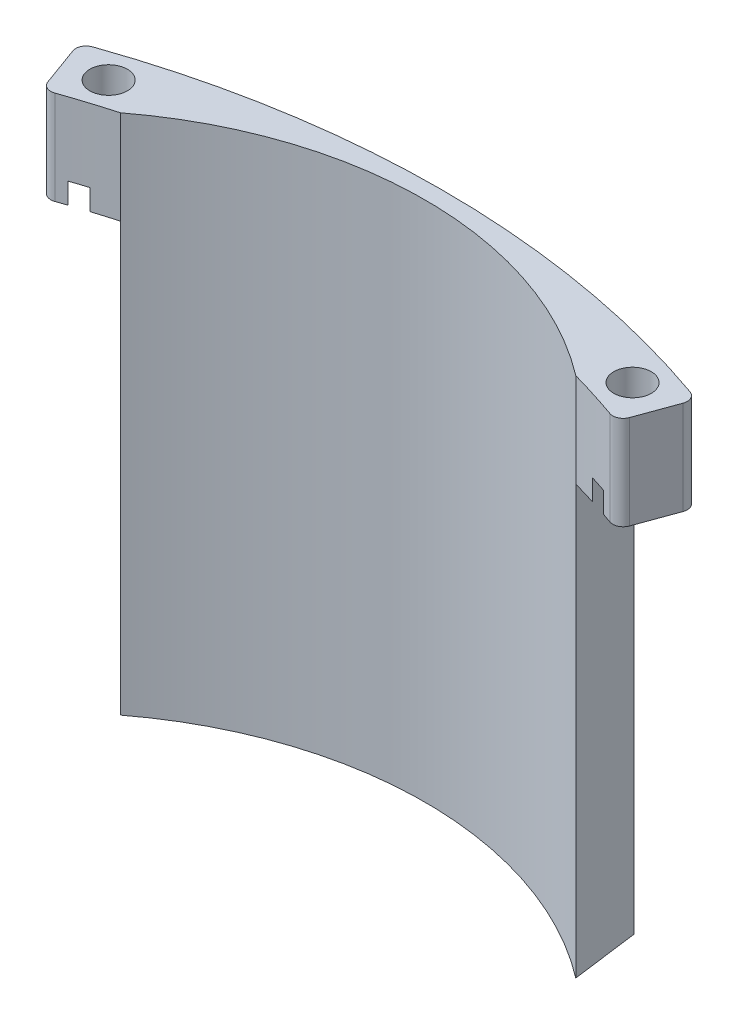
ISO-10303-21;
HEADER;
FILE_DESCRIPTION(('STEP AP214'),'2;1');
FILE_NAME('part.step','',(''),(''),'','','');
FILE_SCHEMA(('AUTOMOTIVE_DESIGN { 1 0 10303 214 1 1 1 1 }'));
ENDSEC;
DATA;
#1=APPLICATION_CONTEXT('core data for automotive mechanical design processes');
#2=APPLICATION_PROTOCOL_DEFINITION('international standard','automotive_design',2000,#1);
#3=PRODUCT_CONTEXT('',#1,'mechanical');
#4=PRODUCT('Part','Part','',(#3));
#5=PRODUCT_RELATED_PRODUCT_CATEGORY('part','',(#4));
#6=PRODUCT_DEFINITION_FORMATION('','',#4);
#7=PRODUCT_DEFINITION_CONTEXT('part definition',#1,'design');
#8=PRODUCT_DEFINITION('design','',#6,#7);
#9=PRODUCT_DEFINITION_SHAPE('','',#8);
#10=(LENGTH_UNIT() NAMED_UNIT(*) SI_UNIT(.MILLI.,.METRE.));
#11=(NAMED_UNIT(*) PLANE_ANGLE_UNIT() SI_UNIT($,.RADIAN.));
#12=(NAMED_UNIT(*) SI_UNIT($,.STERADIAN.) SOLID_ANGLE_UNIT());
#13=UNCERTAINTY_MEASURE_WITH_UNIT(LENGTH_MEASURE(1.E-05),#10,'distance_accuracy_value','');
#14=(GEOMETRIC_REPRESENTATION_CONTEXT(3) GLOBAL_UNCERTAINTY_ASSIGNED_CONTEXT((#13)) GLOBAL_UNIT_ASSIGNED_CONTEXT((#10,
#11,#12)) REPRESENTATION_CONTEXT('',''));
#15=CARTESIAN_POINT('',(0.,0.,0.));
#16=DIRECTION('',(0.,0.,1.));
#17=DIRECTION('',(1.,0.,0.));
#18=AXIS2_PLACEMENT_3D('',#15,#16,#17);
#19=CARTESIAN_POINT('',(-25.1089342586063,0.,-79.6353653874771));
#20=DIRECTION('',(0.,1.,0.));
#21=DIRECTION('',(0.,0.,1.));
#22=AXIS2_PLACEMENT_3D('',#19,#20,#21);
#23=CYLINDRICAL_SURFACE('',#22,1.79999999999999);
#24=CARTESIAN_POINT('',(-25.1089342586063,0.,-79.6353653874771));
#25=DIRECTION('',(0.,1.,0.));
#26=DIRECTION('',(0.,0.,1.));
#27=AXIS2_PLACEMENT_3D('',#24,#25,#26);
#28=CIRCLE('',#27,1.8);
#29=CARTESIAN_POINT('',(-25.1089342586063,0.,-77.8353653874771));
#30=VERTEX_POINT('',#29);
#31=EDGE_CURVE('E369',#30,#30,#28,.T.);
#32=ORIENTED_EDGE('',*,*,#31,.T.);
#33=EDGE_LOOP('',(#32));
#34=FACE_BOUND('',#33,.T.);
#35=CARTESIAN_POINT('',(-25.1089342586063,-7.,-79.6353653874771));
#36=DIRECTION('',(0.,-1.,0.));
#37=DIRECTION('',(0.,0.,-1.));
#38=AXIS2_PLACEMENT_3D('',#35,#36,#37);
#39=CIRCLE('',#38,1.79999999999999);
#40=CARTESIAN_POINT('',(-25.1089342586063,-7.,-81.4353653874771));
#41=VERTEX_POINT('',#40);
#42=EDGE_CURVE('E347',#41,#41,#39,.F.);
#43=ORIENTED_EDGE('',*,*,#42,.F.);
#44=EDGE_LOOP('',(#43));
#45=FACE_BOUND('',#44,.T.);
#46=ADVANCED_FACE('F38',(#34,#45),#23,.F.);
#47=CARTESIAN_POINT('',(25.1089342586069,0.,-79.635365387477));
#48=DIRECTION('',(0.,1.,0.));
#49=DIRECTION('',(0.,0.,1.));
#50=AXIS2_PLACEMENT_3D('',#47,#48,#49);
#51=CYLINDRICAL_SURFACE('',#50,1.79999999999999);
#52=CARTESIAN_POINT('',(25.1089342586069,0.,-79.635365387477));
#53=DIRECTION('',(0.,1.,0.));
#54=DIRECTION('',(0.,0.,1.));
#55=AXIS2_PLACEMENT_3D('',#52,#53,#54);
#56=CIRCLE('',#55,1.8);
#57=CARTESIAN_POINT('',(25.1089342586069,0.,-77.835365387477));
#58=VERTEX_POINT('',#57);
#59=EDGE_CURVE('E388',#58,#58,#56,.T.);
#60=ORIENTED_EDGE('',*,*,#59,.T.);
#61=EDGE_LOOP('',(#60));
#62=FACE_BOUND('',#61,.T.);
#63=CARTESIAN_POINT('',(25.1089342586069,-7.,-79.635365387477));
#64=DIRECTION('',(0.,-1.,0.));
#65=DIRECTION('',(0.,0.,-1.));
#66=AXIS2_PLACEMENT_3D('',#63,#64,#65);
#67=CIRCLE('',#66,1.79999999999999);
#68=CARTESIAN_POINT('',(25.1089342586069,-7.,-81.4353653874769));
#69=VERTEX_POINT('',#68);
#70=EDGE_CURVE('E342',#69,#69,#67,.F.);
#71=ORIENTED_EDGE('',*,*,#70,.F.);
#72=EDGE_LOOP('',(#71));
#73=FACE_BOUND('',#72,.T.);
#74=ADVANCED_FACE('F582',(#62,#73),#51,.F.);
#75=CARTESIAN_POINT('',(0.,-9.,0.));
#76=DIRECTION('',(0.,-1.,0.));
#77=DIRECTION('',(0.,0.,-1.));
#78=AXIS2_PLACEMENT_3D('',#75,#76,#77);
#79=PLANE('',#78);
#80=DIRECTION('',(-0.923665474365648,0.,0.383199806191082));
#81=VECTOR('',#80,1.);
#82=CARTESIAN_POINT('',(-22.3594993092345,-9.,-77.5280904981537));
#83=LINE('',#82,#81);
#84=CARTESIAN_POINT('',(-22.3594993092345,-9.,-77.5280904981537));
#85=VERTEX_POINT('',#84);
#86=CARTESIAN_POINT('',(-24.082211057931,-9.,-76.8133914793591));
#87=VERTEX_POINT('',#86);
#88=EDGE_CURVE('E267',#85,#87,#83,.T.);
#89=ORIENTED_EDGE('',*,*,#88,.F.);
#90=DIRECTION('',(-0.129971970296068,0.,0.991517668494797));
#91=VECTOR('',#90,1.);
#92=CARTESIAN_POINT('',(-21.9092631970093,-9.,-80.9628084550241));
#93=LINE('',#92,#91);
#94=CARTESIAN_POINT('',(-21.9092631970093,-9.,-80.9628084550241));
#95=VERTEX_POINT('',#94);
#96=EDGE_CURVE('E275',#95,#85,#93,.T.);
#97=ORIENTED_EDGE('',*,*,#96,.F.);
#98=DIRECTION('',(0.793693504069575,0.,0.608317862303714));
#99=VECTOR('',#98,1.);
#100=CARTESIAN_POINT('',(30.9827595835421,-9.,-40.424285630017));
#101=LINE('',#100,#99);
#102=CARTESIAN_POINT('',(-24.5088241733932,-9.,-82.9552140473262));
#103=VERTEX_POINT('',#102);
#104=EDGE_CURVE('E427',#103,#95,#101,.T.);
#105=ORIENTED_EDGE('',*,*,#104,.F.);
#106=CARTESIAN_POINT('',(0.,-9.,0.));
#107=DIRECTION('',(0.,-1.,0.));
#108=DIRECTION('',(0.,0.,-1.));
#109=AXIS2_PLACEMENT_3D('',#106,#107,#108);
#110=CIRCLE('',#109,86.5);
#111=CARTESIAN_POINT('',(-20.9788243157622,-9.,-83.9174530734125));
#112=VERTEX_POINT('',#111);
#113=EDGE_CURVE('E358',#103,#112,#110,.T.);
#114=ORIENTED_EDGE('',*,*,#113,.T.);
#115=DIRECTION('',(-0.129971970296075,0.,0.991517668494796));
#116=VECTOR('',#115,1.);
#117=CARTESIAN_POINT('',(-21.821905854432,-9.,-77.4858337044928));
#118=LINE('',#117,#116);
#119=CARTESIAN_POINT('',(-21.821905854432,-9.,-77.4858337044928));
#120=VERTEX_POINT('',#119);
#121=EDGE_CURVE('E361',#112,#120,#118,.T.);
#122=ORIENTED_EDGE('',*,*,#121,.T.);
#123=CARTESIAN_POINT('',(0.,-9.,0.));
#124=DIRECTION('',(0.,1.,0.));
#125=DIRECTION('',(0.,0.,-1.));
#126=AXIS2_PLACEMENT_3D('',#123,#124,#125);
#127=CIRCLE('',#126,80.5);
#128=EDGE_CURVE('E352',#120,#87,#127,.T.);
#129=ORIENTED_EDGE('',*,*,#128,.T.);
#130=EDGE_LOOP('',(#89,#97,#105,#114,#122,#129));
#131=FACE_BOUND('',#130,.T.);
#132=ADVANCED_FACE('F557',(#131),#79,.T.);
#133=CARTESIAN_POINT('',(1.80411241501588E-13,-9.,-3.60822483003176E-13));
#134=DIRECTION('',(0.,1.,0.));
#135=DIRECTION('',(0.,0.,1.));
#136=AXIS2_PLACEMENT_3D('',#133,#134,#135);
#137=PLANE('',#136);
#138=CARTESIAN_POINT('',(0.,-9.,0.));
#139=DIRECTION('',(0.,-1.,0.));
#140=DIRECTION('',(0.,0.,-1.));
#141=AXIS2_PLACEMENT_3D('',#138,#139,#140);
#142=CIRCLE('',#141,86.5);
#143=CARTESIAN_POINT('',(20.9788243157615,-9.,-83.9174530734127));
#144=VERTEX_POINT('',#143);
#145=CARTESIAN_POINT('',(24.5088241733938,-9.,-82.955214047326));
#146=VERTEX_POINT('',#145);
#147=EDGE_CURVE('E378',#144,#146,#142,.T.);
#148=ORIENTED_EDGE('',*,*,#147,.T.);
#149=DIRECTION('',(0.793693504069568,0.,-0.608317862303723));
#150=VECTOR('',#149,1.);
#151=CARTESIAN_POINT('',(21.9092631970098,-9.,-80.9628084550239));
#152=LINE('',#151,#150);
#153=CARTESIAN_POINT('',(21.9092631970098,-9.,-80.9628084550239));
#154=VERTEX_POINT('',#153);
#155=EDGE_CURVE('E297',#154,#146,#152,.T.);
#156=ORIENTED_EDGE('',*,*,#155,.F.);
#157=DIRECTION('',(-0.129971970296084,0.,-0.991517668494795));
#158=VECTOR('',#157,1.);
#159=CARTESIAN_POINT('',(22.3594993092351,-9.,-77.5280904981535));
#160=LINE('',#159,#158);
#161=CARTESIAN_POINT('',(22.3594993092351,-9.,-77.5280904981535));
#162=VERTEX_POINT('',#161);
#163=EDGE_CURVE('E299',#162,#154,#160,.T.);
#164=ORIENTED_EDGE('',*,*,#163,.F.);
#165=DIRECTION('',(0.923665474365652,0.,0.383199806191072));
#166=VECTOR('',#165,1.);
#167=CARTESIAN_POINT('',(30.7242616144948,-9.,-74.0578132352611));
#168=LINE('',#167,#166);
#169=CARTESIAN_POINT('',(24.0822110579322,-9.,-76.8133914793586));
#170=VERTEX_POINT('',#169);
#171=EDGE_CURVE('E423',#162,#170,#168,.T.);
#172=ORIENTED_EDGE('',*,*,#171,.T.);
#173=CARTESIAN_POINT('',(1.80411241501588E-13,-9.,-3.60822483003176E-13));
#174=DIRECTION('',(0.,1.,0.));
#175=DIRECTION('',(0.,0.,1.));
#176=AXIS2_PLACEMENT_3D('',#173,#174,#175);
#177=CIRCLE('',#176,80.4999999999996);
#178=CARTESIAN_POINT('',(21.8219058544314,-9.,-77.4858337044929));
#179=VERTEX_POINT('',#178);
#180=EDGE_CURVE('E384',#170,#179,#177,.T.);
#181=ORIENTED_EDGE('',*,*,#180,.T.);
#182=DIRECTION('',(-0.129971970296086,0.,-0.991517668494795));
#183=VECTOR('',#182,1.);
#184=CARTESIAN_POINT('',(21.8219058544314,-9.,-77.4858337044929));
#185=LINE('',#184,#183);
#186=EDGE_CURVE('E381',#179,#144,#185,.T.);
#187=ORIENTED_EDGE('',*,*,#186,.T.);
#188=EDGE_LOOP('',(#148,#156,#164,#172,#181,#187));
#189=FACE_BOUND('',#188,.T.);
#190=ADVANCED_FACE('F538',(#189),#137,.F.);
#191=CARTESIAN_POINT('',(0.,-50.,0.));
#192=DIRECTION('',(0.,1.,0.));
#193=DIRECTION('',(0.,0.,1.));
#194=AXIS2_PLACEMENT_3D('',#191,#192,#193);
#195=CYLINDRICAL_SURFACE('',#194,80.5);
#196=CARTESIAN_POINT('',(0.,0.,0.));
#197=DIRECTION('',(0.,1.,0.));
#198=DIRECTION('',(0.,0.,1.));
#199=AXIS2_PLACEMENT_3D('',#196,#197,#198);
#200=CIRCLE('',#199,80.5);
#201=CARTESIAN_POINT('',(-26.6023862724428,0.,-75.9773850866937));
#202=VERTEX_POINT('',#201);
#203=CARTESIAN_POINT('',(-21.821905854432,0.,-77.4858337044928));
#204=VERTEX_POINT('',#203);
#205=EDGE_CURVE('E391',#202,#204,#200,.F.);
#206=ORIENTED_EDGE('',*,*,#205,.F.);
#207=DIRECTION('',(0.,1.,0.));
#208=VECTOR('',#207,1.);
#209=CARTESIAN_POINT('',(-26.6023862724428,-50.,-75.9773850866937));
#210=LINE('',#209,#208);
#211=CARTESIAN_POINT('',(-26.6023862724428,-9.,-75.9773850866937));
#212=VERTEX_POINT('',#211);
#213=EDGE_CURVE('E11',#202,#212,#210,.F.);
#214=ORIENTED_EDGE('',*,*,#213,.T.);
#215=CARTESIAN_POINT('',(-25.6807527120393,-9.,-76.2938329102889));
#216=VERTEX_POINT('',#215);
#217=EDGE_CURVE('E356',#216,#212,#127,.T.);
#218=ORIENTED_EDGE('',*,*,#217,.F.);
#219=DIRECTION('',(0.,1.,0.));
#220=VECTOR('',#219,1.);
#221=CARTESIAN_POINT('',(-25.6807527120393,-50.,-76.2938329102889));
#222=LINE('',#221,#220);
#223=CARTESIAN_POINT('',(-25.6807527120394,-7.,-76.2938329102889));
#224=VERTEX_POINT('',#223);
#225=EDGE_CURVE('E332',#224,#216,#222,.F.);
#226=ORIENTED_EDGE('',*,*,#225,.F.);
#227=CARTESIAN_POINT('',(0.,-7.,0.));
#228=DIRECTION('',(0.,-1.,0.));
#229=DIRECTION('',(0.,0.,-1.));
#230=AXIS2_PLACEMENT_3D('',#227,#228,#229);
#231=CIRCLE('',#230,80.5);
#232=CARTESIAN_POINT('',(-24.0822110579312,-7.,-76.813391479359));
#233=VERTEX_POINT('',#232);
#234=EDGE_CURVE('E240',#224,#233,#231,.T.);
#235=ORIENTED_EDGE('',*,*,#234,.T.);
#236=DIRECTION('',(0.,1.,0.));
#237=VECTOR('',#236,1.);
#238=CARTESIAN_POINT('',(-24.0822110579312,-50.,-76.813391479359));
#239=LINE('',#238,#237);
#240=EDGE_CURVE('E340',#87,#233,#239,.T.);
#241=ORIENTED_EDGE('',*,*,#240,.F.);
#242=ORIENTED_EDGE('',*,*,#128,.F.);
#243=DIRECTION('',(0.,1.,0.));
#244=VECTOR('',#243,1.);
#245=CARTESIAN_POINT('',(-21.821905854432,-50.,-77.4858337044928));
#246=LINE('',#245,#244);
#247=EDGE_CURVE('E399',#120,#204,#246,.T.);
#248=ORIENTED_EDGE('',*,*,#247,.T.);
#249=EDGE_LOOP('',(#206,#214,#218,#226,#235,#241,#242,#248));
#250=FACE_BOUND('',#249,.T.);
#251=ADVANCED_FACE('F483',(#250),#195,.F.);
#252=CARTESIAN_POINT('',(0.,-50.,0.));
#253=DIRECTION('',(-0.939692620785908,0.,0.342020143325669));
#254=DIRECTION('',(0.342020143325669,0.,0.939692620785909));
#255=AXIS2_PLACEMENT_3D('',#252,#253,#254);
#256=PLANE('',#255);
#257=DIRECTION('',(0.342020143325669,0.,0.939692620785909));
#258=VECTOR('',#257,1.);
#259=CARTESIAN_POINT('',(0.,0.,0.));
#260=LINE('',#259,#258);
#261=CARTESIAN_POINT('',(-29.2407220681417,0.,-80.3382236107676));
#262=VERTEX_POINT('',#261);
#263=CARTESIAN_POINT('',(-27.8725433189734,0.,-76.57918339165));
#264=VERTEX_POINT('',#263);
#265=EDGE_CURVE('E396',#262,#264,#260,.T.);
#266=ORIENTED_EDGE('',*,*,#265,.F.);
#267=DIRECTION('',(0.,-1.,0.));
#268=VECTOR('',#267,1.);
#269=CARTESIAN_POINT('',(-29.2407220681417,-9.,-80.3382236107676));
#270=LINE('',#269,#268);
#271=CARTESIAN_POINT('',(-29.2407220681417,-9.,-80.3382236107676));
#272=VERTEX_POINT('',#271);
#273=EDGE_CURVE('E59',#262,#272,#270,.T.);
#274=ORIENTED_EDGE('',*,*,#273,.T.);
#275=DIRECTION('',(-0.342020143325669,0.,-0.939692620785908));
#276=VECTOR('',#275,1.);
#277=CARTESIAN_POINT('',(-27.5326215377164,-9.,-75.6452559732656));
#278=LINE('',#277,#276);
#279=CARTESIAN_POINT('',(-27.8725433189734,-9.,-76.57918339165));
#280=VERTEX_POINT('',#279);
#281=EDGE_CURVE('E355',#280,#272,#278,.T.);
#282=ORIENTED_EDGE('',*,*,#281,.F.);
#283=DIRECTION('',(0.,1.,0.));
#284=VECTOR('',#283,1.);
#285=CARTESIAN_POINT('',(-27.8725433189734,-50.,-76.57918339165));
#286=LINE('',#285,#284);
#287=EDGE_CURVE('E458',#280,#264,#286,.T.);
#288=ORIENTED_EDGE('',*,*,#287,.T.);
#289=EDGE_LOOP('',(#266,#274,#282,#288));
#290=FACE_BOUND('',#289,.T.);
#291=ADVANCED_FACE('F478',(#290),#256,.T.);
#292=CARTESIAN_POINT('',(0.,-50.,0.));
#293=DIRECTION('',(0.,1.,0.));
#294=DIRECTION('',(0.,0.,1.));
#295=AXIS2_PLACEMENT_3D('',#292,#293,#294);
#296=CYLINDRICAL_SURFACE('',#295,86.5);
#297=CARTESIAN_POINT('',(0.,0.,0.));
#298=DIRECTION('',(0.,1.,0.));
#299=DIRECTION('',(0.,0.,1.));
#300=AXIS2_PLACEMENT_3D('',#297,#298,#299);
#301=CIRCLE('',#300,86.5);
#302=CARTESIAN_POINT('',(-28.6320356397225,0.,-81.6238723360125));
#303=VERTEX_POINT('',#302);
#304=CARTESIAN_POINT('',(28.6320356397219,0.,-81.6238723360127));
#305=VERTEX_POINT('',#304);
#306=EDGE_CURVE('E409',#303,#305,#301,.F.);
#307=ORIENTED_EDGE('',*,*,#306,.T.);
#308=DIRECTION('',(0.,1.,0.));
#309=VECTOR('',#308,1.);
#310=CARTESIAN_POINT('',(28.6320356397219,-50.,-81.6238723360127));
#311=LINE('',#310,#309);
#312=CARTESIAN_POINT('',(28.6320356397219,-9.,-81.6238723360127));
#313=VERTEX_POINT('',#312);
#314=EDGE_CURVE('E449',#305,#313,#311,.F.);
#315=ORIENTED_EDGE('',*,*,#314,.T.);
#316=CARTESIAN_POINT('',(26.1378498809145,-9.,-82.4564297286924));
#317=VERTEX_POINT('',#316);
#318=EDGE_CURVE('E377',#317,#313,#142,.T.);
#319=ORIENTED_EDGE('',*,*,#318,.F.);
#320=DIRECTION('',(0.,1.,0.));
#321=VECTOR('',#320,1.);
#322=CARTESIAN_POINT('',(26.1378498809146,-50.,-82.4564297286923));
#323=LINE('',#322,#321);
#324=CARTESIAN_POINT('',(26.1378498809146,-7.,-82.4564297286923));
#325=VERTEX_POINT('',#324);
#326=EDGE_CURVE('E329',#317,#325,#323,.T.);
#327=ORIENTED_EDGE('',*,*,#326,.T.);
#328=CARTESIAN_POINT('',(0.,-7.,0.));
#329=DIRECTION('',(0.,-1.,0.));
#330=DIRECTION('',(0.,0.,-1.));
#331=AXIS2_PLACEMENT_3D('',#328,#329,#330);
#332=CIRCLE('',#331,86.5);
#333=CARTESIAN_POINT('',(24.5088241733938,-7.,-82.955214047326));
#334=VERTEX_POINT('',#333);
#335=EDGE_CURVE('E345',#334,#325,#332,.T.);
#336=ORIENTED_EDGE('',*,*,#335,.F.);
#337=DIRECTION('',(0.,1.,0.));
#338=VECTOR('',#337,1.);
#339=CARTESIAN_POINT('',(24.5088241733937,-50.,-82.955214047326));
#340=LINE('',#339,#338);
#341=EDGE_CURVE('E326',#334,#146,#340,.F.);
#342=ORIENTED_EDGE('',*,*,#341,.T.);
#343=ORIENTED_EDGE('',*,*,#147,.F.);
#344=DIRECTION('',(0.,-1.,0.));
#345=VECTOR('',#344,1.);
#346=CARTESIAN_POINT('',(20.9788243157615,-9.,-83.9174530734127));
#347=LINE('',#346,#345);
#348=CARTESIAN_POINT('',(20.9788243157615,-50.,-83.9174530734127));
#349=VERTEX_POINT('',#348);
#350=EDGE_CURVE('E351',#144,#349,#347,.T.);
#351=ORIENTED_EDGE('',*,*,#350,.T.);
#352=CARTESIAN_POINT('',(0.,-50.,0.));
#353=DIRECTION('',(0.,1.,0.));
#354=DIRECTION('',(0.,0.,1.));
#355=AXIS2_PLACEMENT_3D('',#352,#353,#354);
#356=CIRCLE('',#355,86.5);
#357=CARTESIAN_POINT('',(-20.9788243157622,-50.,-83.9174530734125));
#358=VERTEX_POINT('',#357);
#359=EDGE_CURVE('E395',#358,#349,#356,.F.);
#360=ORIENTED_EDGE('',*,*,#359,.F.);
#361=DIRECTION('',(0.,-1.,0.));
#362=VECTOR('',#361,1.);
#363=CARTESIAN_POINT('',(-20.9788243157622,-9.,-83.9174530734125));
#364=LINE('',#363,#362);
#365=EDGE_CURVE('E364',#112,#358,#364,.T.);
#366=ORIENTED_EDGE('',*,*,#365,.F.);
#367=ORIENTED_EDGE('',*,*,#113,.F.);
#368=DIRECTION('',(0.,1.,0.));
#369=VECTOR('',#368,1.);
#370=CARTESIAN_POINT('',(-24.5088241733932,-50.,-82.9552140473262));
#371=LINE('',#370,#369);
#372=CARTESIAN_POINT('',(-24.5088241733932,-7.,-82.9552140473262));
#373=VERTEX_POINT('',#372);
#374=EDGE_CURVE('E337',#103,#373,#371,.T.);
#375=ORIENTED_EDGE('',*,*,#374,.T.);
#376=CARTESIAN_POINT('',(0.,-7.,0.));
#377=DIRECTION('',(0.,-1.,0.));
#378=DIRECTION('',(0.,0.,-1.));
#379=AXIS2_PLACEMENT_3D('',#376,#377,#378);
#380=CIRCLE('',#379,86.5);
#381=CARTESIAN_POINT('',(-26.1378498809138,-7.,-82.4564297286926));
#382=VERTEX_POINT('',#381);
#383=EDGE_CURVE('E429',#382,#373,#380,.T.);
#384=ORIENTED_EDGE('',*,*,#383,.F.);
#385=DIRECTION('',(0.,1.,0.));
#386=VECTOR('',#385,1.);
#387=CARTESIAN_POINT('',(-26.1378498809138,-50.,-82.4564297286926));
#388=LINE('',#387,#386);
#389=CARTESIAN_POINT('',(-26.1378498809138,-9.,-82.4564297286926));
#390=VERTEX_POINT('',#389);
#391=EDGE_CURVE('E334',#382,#390,#388,.F.);
#392=ORIENTED_EDGE('',*,*,#391,.T.);
#393=CARTESIAN_POINT('',(-28.6320356397225,-9.,-81.6238723360125));
#394=VERTEX_POINT('',#393);
#395=EDGE_CURVE('E359',#394,#390,#110,.T.);
#396=ORIENTED_EDGE('',*,*,#395,.F.);
#397=DIRECTION('',(0.,1.,0.));
#398=VECTOR('',#397,1.);
#399=CARTESIAN_POINT('',(-28.6320356397225,-50.,-81.6238723360125));
#400=LINE('',#399,#398);
#401=EDGE_CURVE('E446',#394,#303,#400,.T.);
#402=ORIENTED_EDGE('',*,*,#401,.T.);
#403=EDGE_LOOP('',(#307,#315,#319,#327,#336,#342,#343,#351,#360,#366,#367,#375,#384,#392,#396,#402));
#404=FACE_BOUND('',#403,.T.);
#405=ADVANCED_FACE('F471',(#404),#296,.T.);
#406=CARTESIAN_POINT('',(0.,-50.,0.));
#407=DIRECTION('',(-0.939692620785911,0.,-0.342020143325662));
#408=DIRECTION('',(-0.342020143325662,0.,0.939692620785911));
#409=AXIS2_PLACEMENT_3D('',#406,#407,#408);
#410=PLANE('',#409);
#411=DIRECTION('',(-0.342020143325662,0.,0.939692620785911));
#412=VECTOR('',#411,1.);
#413=CARTESIAN_POINT('',(27.5326215377158,-9.,-75.6452559732658));
#414=LINE('',#413,#412);
#415=CARTESIAN_POINT('',(29.2407220681411,-9.,-80.3382236107678));
#416=VERTEX_POINT('',#415);
#417=CARTESIAN_POINT('',(27.8725433189728,-9.,-76.5791833916502));
#418=VERTEX_POINT('',#417);
#419=EDGE_CURVE('E372',#416,#418,#414,.T.);
#420=ORIENTED_EDGE('',*,*,#419,.F.);
#421=DIRECTION('',(0.,1.,0.));
#422=VECTOR('',#421,1.);
#423=CARTESIAN_POINT('',(29.2407220681411,-50.,-80.3382236107678));
#424=LINE('',#423,#422);
#425=CARTESIAN_POINT('',(29.2407220681411,0.,-80.3382236107678));
#426=VERTEX_POINT('',#425);
#427=EDGE_CURVE('E435',#416,#426,#424,.T.);
#428=ORIENTED_EDGE('',*,*,#427,.T.);
#429=DIRECTION('',(-0.342020143325662,0.,0.939692620785911));
#430=VECTOR('',#429,1.);
#431=CARTESIAN_POINT('',(0.,0.,0.));
#432=LINE('',#431,#430);
#433=CARTESIAN_POINT('',(27.8725433189728,0.,-76.5791833916501));
#434=VERTEX_POINT('',#433);
#435=EDGE_CURVE('E406',#426,#434,#432,.T.);
#436=ORIENTED_EDGE('',*,*,#435,.T.);
#437=DIRECTION('',(0.,1.,0.));
#438=VECTOR('',#437,1.);
#439=CARTESIAN_POINT('',(27.8725433189728,-50.,-76.5791833916502));
#440=LINE('',#439,#438);
#441=EDGE_CURVE('E433',#434,#418,#440,.F.);
#442=ORIENTED_EDGE('',*,*,#441,.T.);
#443=EDGE_LOOP('',(#420,#428,#436,#442));
#444=FACE_BOUND('',#443,.T.);
#445=ADVANCED_FACE('F505',(#444),#410,.F.);
#446=CARTESIAN_POINT('',(0.,-50.,0.));
#447=DIRECTION('',(0.,1.,0.));
#448=DIRECTION('',(0.,0.,1.));
#449=AXIS2_PLACEMENT_3D('',#446,#447,#448);
#450=CYLINDRICAL_SURFACE('',#449,80.5);
#451=CARTESIAN_POINT('',(26.6023862724423,-9.,-75.9773850866939));
#452=VERTEX_POINT('',#451);
#453=CARTESIAN_POINT('',(25.6807527120399,-9.,-76.2938329102887));
#454=VERTEX_POINT('',#453);
#455=EDGE_CURVE('E374',#452,#454,#177,.T.);
#456=ORIENTED_EDGE('',*,*,#455,.F.);
#457=DIRECTION('',(0.,1.,0.));
#458=VECTOR('',#457,1.);
#459=CARTESIAN_POINT('',(26.6023862724423,-50.,-75.9773850866939));
#460=LINE('',#459,#458);
#461=CARTESIAN_POINT('',(26.6023862724423,0.,-75.9773850866939));
#462=VERTEX_POINT('',#461);
#463=EDGE_CURVE('E455',#452,#462,#460,.T.);
#464=ORIENTED_EDGE('',*,*,#463,.T.);
#465=CARTESIAN_POINT('',(0.,0.,0.));
#466=DIRECTION('',(0.,1.,0.));
#467=DIRECTION('',(0.,0.,1.));
#468=AXIS2_PLACEMENT_3D('',#465,#466,#467);
#469=CIRCLE('',#468,80.5);
#470=CARTESIAN_POINT('',(21.8219058544314,0.,-77.4858337044929));
#471=VERTEX_POINT('',#470);
#472=EDGE_CURVE('E404',#462,#471,#469,.T.);
#473=ORIENTED_EDGE('',*,*,#472,.T.);
#474=DIRECTION('',(0.,1.,0.));
#475=VECTOR('',#474,1.);
#476=CARTESIAN_POINT('',(21.8219058544314,-50.,-77.4858337044929));
#477=LINE('',#476,#475);
#478=EDGE_CURVE('E418',#179,#471,#477,.T.);
#479=ORIENTED_EDGE('',*,*,#478,.F.);
#480=ORIENTED_EDGE('',*,*,#180,.F.);
#481=DIRECTION('',(0.,1.,0.));
#482=VECTOR('',#481,1.);
#483=CARTESIAN_POINT('',(24.0822110579319,-50.,-76.8133914793588));
#484=LINE('',#483,#482);
#485=CARTESIAN_POINT('',(24.0822110579322,-7.,-76.8133914793587));
#486=VERTEX_POINT('',#485);
#487=EDGE_CURVE('E323',#170,#486,#484,.T.);
#488=ORIENTED_EDGE('',*,*,#487,.T.);
#489=CARTESIAN_POINT('',(0.,-7.,0.));
#490=DIRECTION('',(0.,-1.,0.));
#491=DIRECTION('',(0.,0.,-1.));
#492=AXIS2_PLACEMENT_3D('',#489,#490,#491);
#493=CIRCLE('',#492,80.5);
#494=CARTESIAN_POINT('',(25.6807527120399,-7.,-76.2938329102887));
#495=VERTEX_POINT('',#494);
#496=EDGE_CURVE('E343',#495,#486,#493,.F.);
#497=ORIENTED_EDGE('',*,*,#496,.F.);
#498=DIRECTION('',(0.,1.,0.));
#499=VECTOR('',#498,1.);
#500=CARTESIAN_POINT('',(25.6807527120399,-50.,-76.2938329102887));
#501=LINE('',#500,#499);
#502=EDGE_CURVE('E280',#495,#454,#501,.F.);
#503=ORIENTED_EDGE('',*,*,#502,.T.);
#504=EDGE_LOOP('',(#456,#464,#473,#479,#480,#488,#497,#503));
#505=FACE_BOUND('',#504,.T.);
#506=ADVANCED_FACE('F496',(#505),#450,.F.);
#507=CARTESIAN_POINT('',(-1.71772058891842E-13,-50.,-48.8536066712997));
#508=DIRECTION('',(0.,1.,0.));
#509=DIRECTION('',(0.,0.,1.));
#510=AXIS2_PLACEMENT_3D('',#507,#508,#509);
#511=CYLINDRICAL_SURFACE('',#510,36.);
#512=CARTESIAN_POINT('',(-1.71772058891842E-13,0.,-48.8536066712997));
#513=DIRECTION('',(0.,1.,0.));
#514=DIRECTION('',(0.,0.,1.));
#515=AXIS2_PLACEMENT_3D('',#512,#513,#514);
#516=CIRCLE('',#515,36.);
#517=EDGE_CURVE('E401',#204,#471,#516,.F.);
#518=ORIENTED_EDGE('',*,*,#517,.F.);
#519=ORIENTED_EDGE('',*,*,#247,.F.);
#520=CARTESIAN_POINT('',(-21.821905854432,-50.,-77.4858337044928));
#521=VERTEX_POINT('',#520);
#522=EDGE_CURVE('E419',#521,#120,#246,.T.);
#523=ORIENTED_EDGE('',*,*,#522,.F.);
#524=CARTESIAN_POINT('',(-1.71772058891842E-13,-50.,-48.8536066712997));
#525=DIRECTION('',(0.,1.,0.));
#526=DIRECTION('',(0.,0.,1.));
#527=AXIS2_PLACEMENT_3D('',#524,#525,#526);
#528=CIRCLE('',#527,36.);
#529=CARTESIAN_POINT('',(21.8219058544314,-50.,-77.4858337044929));
#530=VERTEX_POINT('',#529);
#531=EDGE_CURVE('E392',#521,#530,#528,.F.);
#532=ORIENTED_EDGE('',*,*,#531,.T.);
#533=EDGE_CURVE('E414',#530,#179,#477,.T.);
#534=ORIENTED_EDGE('',*,*,#533,.T.);
#535=ORIENTED_EDGE('',*,*,#478,.T.);
#536=EDGE_LOOP('',(#518,#519,#523,#532,#534,#535));
#537=FACE_BOUND('',#536,.T.);
#538=ADVANCED_FACE('F491',(#537),#511,.F.);
#539=CARTESIAN_POINT('',(0.,-50.,0.));
#540=DIRECTION('',(0.,1.,0.));
#541=DIRECTION('',(0.,0.,1.));
#542=AXIS2_PLACEMENT_3D('',#539,#540,#541);
#543=PLANE('',#542);
#544=ORIENTED_EDGE('',*,*,#531,.F.);
#545=DIRECTION('',(-0.129971970296075,0.,0.991517668494796));
#546=VECTOR('',#545,1.);
#547=CARTESIAN_POINT('',(-21.821905854432,-50.,-77.4858337044928));
#548=LINE('',#547,#546);
#549=EDGE_CURVE('E365',#358,#521,#548,.T.);
#550=ORIENTED_EDGE('',*,*,#549,.F.);
#551=ORIENTED_EDGE('',*,*,#359,.T.);
#552=DIRECTION('',(-0.129971970296086,0.,-0.991517668494795));
#553=VECTOR('',#552,1.);
#554=CARTESIAN_POINT('',(21.8219058544314,-50.,-77.4858337044929));
#555=LINE('',#554,#553);
#556=EDGE_CURVE('E367',#530,#349,#555,.T.);
#557=ORIENTED_EDGE('',*,*,#556,.F.);
#558=EDGE_LOOP('',(#544,#550,#551,#557));
#559=FACE_BOUND('',#558,.T.);
#560=ADVANCED_FACE('F549',(#559),#543,.F.);
#561=CARTESIAN_POINT('',(0.,0.,0.));
#562=DIRECTION('',(0.,1.,0.));
#563=DIRECTION('',(0.,0.,1.));
#564=AXIS2_PLACEMENT_3D('',#561,#562,#563);
#565=PLANE('',#564);
#566=ORIENTED_EDGE('',*,*,#31,.F.);
#567=EDGE_LOOP('',(#566));
#568=FACE_BOUND('',#567,.T.);
#569=ORIENTED_EDGE('',*,*,#59,.F.);
#570=EDGE_LOOP('',(#569));
#571=FACE_BOUND('',#570,.T.);
#572=ORIENTED_EDGE('',*,*,#435,.F.);
#573=CARTESIAN_POINT('',(28.3010294473552,0.,-80.6802437540935));
#574=DIRECTION('',(0.,1.,0.));
#575=DIRECTION('',(0.,0.,1.));
#576=AXIS2_PLACEMENT_3D('',#573,#574,#575);
#577=CIRCLE('',#576,1.);
#578=EDGE_CURVE('E444',#426,#305,#577,.T.);
#579=ORIENTED_EDGE('',*,*,#578,.T.);
#580=ORIENTED_EDGE('',*,*,#306,.F.);
#581=CARTESIAN_POINT('',(-28.3010294473558,0.,-80.6802437540933));
#582=DIRECTION('',(0.,1.,0.));
#583=DIRECTION('',(0.,0.,1.));
#584=AXIS2_PLACEMENT_3D('',#581,#582,#583);
#585=CIRCLE('',#584,1.);
#586=EDGE_CURVE('E440',#303,#262,#585,.T.);
#587=ORIENTED_EDGE('',*,*,#586,.T.);
#588=ORIENTED_EDGE('',*,*,#265,.T.);
#589=CARTESIAN_POINT('',(-26.9328506981875,0.,-76.9212035349756));
#590=DIRECTION('',(0.,1.,0.));
#591=DIRECTION('',(0.,0.,1.));
#592=AXIS2_PLACEMENT_3D('',#589,#590,#591);
#593=CIRCLE('',#592,1.);
#594=EDGE_CURVE('E438',#264,#202,#593,.T.);
#595=ORIENTED_EDGE('',*,*,#594,.T.);
#596=ORIENTED_EDGE('',*,*,#205,.T.);
#597=ORIENTED_EDGE('',*,*,#517,.T.);
#598=ORIENTED_EDGE('',*,*,#472,.F.);
#599=CARTESIAN_POINT('',(26.9328506981869,0.,-76.9212035349758));
#600=DIRECTION('',(0.,1.,0.));
#601=DIRECTION('',(0.,0.,1.));
#602=AXIS2_PLACEMENT_3D('',#599,#600,#601);
#603=CIRCLE('',#602,1.);
#604=EDGE_CURVE('E442',#462,#434,#603,.T.);
#605=ORIENTED_EDGE('',*,*,#604,.T.);
#606=EDGE_LOOP('',(#572,#579,#580,#587,#588,#595,#596,#597,#598,#605));
#607=FACE_BOUND('',#606,.T.);
#608=ADVANCED_FACE('F477',(#568,#571,#607),#565,.T.);
#609=ORIENTED_EDGE('',*,*,#281,.T.);
#610=CARTESIAN_POINT('',(-28.3010294473558,-9.,-80.6802437540933));
#611=DIRECTION('',(0.,-1.,0.));
#612=DIRECTION('',(0.,0.,-1.));
#613=AXIS2_PLACEMENT_3D('',#610,#611,#612);
#614=CIRCLE('',#613,1.);
#615=EDGE_CURVE('E46',#272,#394,#614,.T.);
#616=ORIENTED_EDGE('',*,*,#615,.T.);
#617=ORIENTED_EDGE('',*,*,#395,.T.);
#618=DIRECTION('',(0.923665474365647,0.,-0.383199806191083));
#619=VECTOR('',#618,1.);
#620=CARTESIAN_POINT('',(-27.858369207978,-9.,-81.7426402768006));
#621=LINE('',#620,#619);
#622=CARTESIAN_POINT('',(-27.858369207978,-9.,-81.7426402768006));
#623=VERTEX_POINT('',#622);
#624=EDGE_CURVE('E272',#623,#390,#621,.T.);
#625=ORIENTED_EDGE('',*,*,#624,.F.);
#626=DIRECTION('',(0.129971970296073,0.,-0.991517668494796));
#627=VECTOR('',#626,1.);
#628=CARTESIAN_POINT('',(-28.3086053202033,-9.,-78.3079223199301));
#629=LINE('',#628,#627);
#630=CARTESIAN_POINT('',(-28.3086053202033,-9.,-78.3079223199301));
#631=VERTEX_POINT('',#630);
#632=EDGE_CURVE('E269',#631,#623,#629,.T.);
#633=ORIENTED_EDGE('',*,*,#632,.F.);
#634=DIRECTION('',(-0.793693504069574,0.,-0.608317862303715));
#635=VECTOR('',#634,1.);
#636=CARTESIAN_POINT('',(27.3328524097198,-9.,-35.6621246055995));
#637=LINE('',#636,#635);
#638=EDGE_CURVE('E249',#216,#631,#637,.T.);
#639=ORIENTED_EDGE('',*,*,#638,.F.);
#640=ORIENTED_EDGE('',*,*,#217,.T.);
#641=CARTESIAN_POINT('',(-26.9328506981875,-9.,-76.9212035349756));
#642=DIRECTION('',(0.,-1.,0.));
#643=DIRECTION('',(0.,0.,-1.));
#644=AXIS2_PLACEMENT_3D('',#641,#642,#643);
#645=CIRCLE('',#644,1.);
#646=EDGE_CURVE('E462',#212,#280,#645,.T.);
#647=ORIENTED_EDGE('',*,*,#646,.T.);
#648=EDGE_LOOP('',(#609,#616,#617,#625,#633,#639,#640,#647));
#649=FACE_BOUND('',#648,.T.);
#650=ADVANCED_FACE('F466',(#649),#79,.T.);
#651=CARTESIAN_POINT('',(-21.821905854432,-9.,-77.4858337044928));
#652=DIRECTION('',(0.991517668494796,0.,0.129971970296075));
#653=DIRECTION('',(0.129971970296075,0.,-0.991517668494796));
#654=AXIS2_PLACEMENT_3D('',#651,#652,#653);
#655=PLANE('',#654);
#656=ORIENTED_EDGE('',*,*,#549,.T.);
#657=ORIENTED_EDGE('',*,*,#522,.T.);
#658=ORIENTED_EDGE('',*,*,#121,.F.);
#659=ORIENTED_EDGE('',*,*,#365,.T.);
#660=EDGE_LOOP('',(#656,#657,#658,#659));
#661=FACE_BOUND('',#660,.T.);
#662=ADVANCED_FACE('F551',(#661),#655,.F.);
#663=ORIENTED_EDGE('',*,*,#318,.T.);
#664=CARTESIAN_POINT('',(28.3010294473552,-9.,-80.6802437540935));
#665=DIRECTION('',(0.,1.,0.));
#666=DIRECTION('',(0.,0.,1.));
#667=AXIS2_PLACEMENT_3D('',#664,#665,#666);
#668=CIRCLE('',#667,1.);
#669=EDGE_CURVE('E453',#313,#416,#668,.F.);
#670=ORIENTED_EDGE('',*,*,#669,.T.);
#671=ORIENTED_EDGE('',*,*,#419,.T.);
#672=CARTESIAN_POINT('',(26.9328506981869,-9.,-76.9212035349758));
#673=DIRECTION('',(0.,1.,0.));
#674=DIRECTION('',(0.,0.,1.));
#675=AXIS2_PLACEMENT_3D('',#672,#673,#674);
#676=CIRCLE('',#675,1.);
#677=EDGE_CURVE('E451',#418,#452,#676,.F.);
#678=ORIENTED_EDGE('',*,*,#677,.T.);
#679=ORIENTED_EDGE('',*,*,#455,.T.);
#680=DIRECTION('',(-0.793693504069569,0.,0.608317862303721));
#681=VECTOR('',#680,1.);
#682=CARTESIAN_POINT('',(28.3086053202039,-9.,-78.30792231993));
#683=LINE('',#682,#681);
#684=CARTESIAN_POINT('',(28.3086053202039,-9.,-78.30792231993));
#685=VERTEX_POINT('',#684);
#686=EDGE_CURVE('E303',#685,#454,#683,.T.);
#687=ORIENTED_EDGE('',*,*,#686,.F.);
#688=DIRECTION('',(0.129971970296084,0.,0.991517668494795));
#689=VECTOR('',#688,1.);
#690=CARTESIAN_POINT('',(27.8583692079786,-9.,-81.7426402768004));
#691=LINE('',#690,#689);
#692=CARTESIAN_POINT('',(27.8583692079786,-9.,-81.7426402768004));
#693=VERTEX_POINT('',#692);
#694=EDGE_CURVE('E270',#693,#685,#691,.T.);
#695=ORIENTED_EDGE('',*,*,#694,.F.);
#696=DIRECTION('',(-0.923665474365652,0.,-0.383199806191073));
#697=VECTOR('',#696,1.);
#698=CARTESIAN_POINT('',(33.0234604516412,-9.,-79.5998060814549));
#699=LINE('',#698,#697);
#700=EDGE_CURVE('E417',#693,#317,#699,.T.);
#701=ORIENTED_EDGE('',*,*,#700,.T.);
#702=EDGE_LOOP('',(#663,#670,#671,#678,#679,#687,#695,#701));
#703=FACE_BOUND('',#702,.T.);
#704=ADVANCED_FACE('F509',(#703),#137,.F.);
#705=CARTESIAN_POINT('',(21.8219058544314,-9.,-77.4858337044929));
#706=DIRECTION('',(-0.991517668494795,0.,0.129971970296086));
#707=DIRECTION('',(0.129971970296086,0.,0.991517668494795));
#708=AXIS2_PLACEMENT_3D('',#705,#706,#707);
#709=PLANE('',#708);
#710=ORIENTED_EDGE('',*,*,#556,.T.);
#711=ORIENTED_EDGE('',*,*,#350,.F.);
#712=ORIENTED_EDGE('',*,*,#186,.F.);
#713=ORIENTED_EDGE('',*,*,#533,.F.);
#714=EDGE_LOOP('',(#710,#711,#712,#713));
#715=FACE_BOUND('',#714,.T.);
#716=ADVANCED_FACE('F542',(#715),#709,.F.);
#717=CARTESIAN_POINT('',(0.,-7.,0.));
#718=DIRECTION('',(0.,-1.,0.));
#719=DIRECTION('',(0.,0.,-1.));
#720=AXIS2_PLACEMENT_3D('',#717,#718,#719);
#721=PLANE('',#720);
#722=ORIENTED_EDGE('',*,*,#70,.T.);
#723=EDGE_LOOP('',(#722));
#724=FACE_BOUND('',#723,.T.);
#725=ORIENTED_EDGE('',*,*,#335,.T.);
#726=DIRECTION('',(0.923665474365652,0.,0.383199806191073));
#727=VECTOR('',#726,1.);
#728=CARTESIAN_POINT('',(24.6586981463816,-7.,-83.0700833443474));
#729=LINE('',#728,#727);
#730=CARTESIAN_POINT('',(27.8583692079786,-7.,-81.7426402768004));
#731=VERTEX_POINT('',#730);
#732=EDGE_CURVE('E288',#325,#731,#729,.T.);
#733=ORIENTED_EDGE('',*,*,#732,.T.);
#734=DIRECTION('',(0.129971970296084,0.,0.991517668494795));
#735=VECTOR('',#734,1.);
#736=CARTESIAN_POINT('',(27.8583692079786,-7.,-81.7426402768004));
#737=LINE('',#736,#735);
#738=CARTESIAN_POINT('',(28.3086053202039,-7.,-78.30792231993));
#739=VERTEX_POINT('',#738);
#740=EDGE_CURVE('E300',#731,#739,#737,.T.);
#741=ORIENTED_EDGE('',*,*,#740,.T.);
#742=DIRECTION('',(-0.793693504069569,0.,0.608317862303721));
#743=VECTOR('',#742,1.);
#744=CARTESIAN_POINT('',(28.3086053202039,-7.,-78.30792231993));
#745=LINE('',#744,#743);
#746=EDGE_CURVE('E316',#739,#495,#745,.T.);
#747=ORIENTED_EDGE('',*,*,#746,.T.);
#748=ORIENTED_EDGE('',*,*,#496,.T.);
#749=DIRECTION('',(-0.923665474365652,0.,-0.383199806191072));
#750=VECTOR('',#749,1.);
#751=CARTESIAN_POINT('',(25.5591703708322,-7.,-76.2006474306065));
#752=LINE('',#751,#750);
#753=CARTESIAN_POINT('',(22.3594993092351,-7.,-77.5280904981535));
#754=VERTEX_POINT('',#753);
#755=EDGE_CURVE('E314',#486,#754,#752,.T.);
#756=ORIENTED_EDGE('',*,*,#755,.T.);
#757=DIRECTION('',(-0.129971970296084,0.,-0.991517668494795));
#758=VECTOR('',#757,1.);
#759=CARTESIAN_POINT('',(22.3594993092351,-7.,-77.5280904981535));
#760=LINE('',#759,#758);
#761=CARTESIAN_POINT('',(21.9092631970098,-7.,-80.9628084550239));
#762=VERTEX_POINT('',#761);
#763=EDGE_CURVE('E311',#754,#762,#760,.T.);
#764=ORIENTED_EDGE('',*,*,#763,.T.);
#765=DIRECTION('',(0.793693504069568,0.,-0.608317862303723));
#766=VECTOR('',#765,1.);
#767=CARTESIAN_POINT('',(21.9092631970098,-7.,-80.9628084550239));
#768=LINE('',#767,#766);
#769=EDGE_CURVE('E308',#762,#334,#768,.T.);
#770=ORIENTED_EDGE('',*,*,#769,.T.);
#771=EDGE_LOOP('',(#725,#733,#741,#747,#748,#756,#764,#770));
#772=FACE_BOUND('',#771,.T.);
#773=ADVANCED_FACE('F530',(#724,#772),#721,.T.);
#774=CARTESIAN_POINT('',(24.6586981463816,-7.,-83.0700833443474));
#775=DIRECTION('',(0.383199806191073,0.,-0.923665474365652));
#776=DIRECTION('',(-0.923665474365652,0.,-0.383199806191073));
#777=AXIS2_PLACEMENT_3D('',#774,#775,#776);
#778=PLANE('',#777);
#779=ORIENTED_EDGE('',*,*,#700,.F.);
#780=DIRECTION('',(0.,-1.,0.));
#781=VECTOR('',#780,1.);
#782=CARTESIAN_POINT('',(27.8583692079786,-7.,-81.7426402768004));
#783=LINE('',#782,#781);
#784=EDGE_CURVE('E294',#731,#693,#783,.T.);
#785=ORIENTED_EDGE('',*,*,#784,.F.);
#786=ORIENTED_EDGE('',*,*,#732,.F.);
#787=ORIENTED_EDGE('',*,*,#326,.F.);
#788=EDGE_LOOP('',(#779,#785,#786,#787));
#789=FACE_BOUND('',#788,.T.);
#790=ADVANCED_FACE('F518',(#789),#778,.F.);
#791=CARTESIAN_POINT('',(21.9092631970098,-7.,-80.9628084550239));
#792=DIRECTION('',(-0.608317862303723,0.,-0.793693504069568));
#793=DIRECTION('',(-0.793693504069568,0.,0.608317862303723));
#794=AXIS2_PLACEMENT_3D('',#791,#792,#793);
#795=PLANE('',#794);
#796=ORIENTED_EDGE('',*,*,#769,.F.);
#797=DIRECTION('',(0.,-1.,0.));
#798=VECTOR('',#797,1.);
#799=CARTESIAN_POINT('',(21.9092631970098,-7.,-80.9628084550239));
#800=LINE('',#799,#798);
#801=EDGE_CURVE('E292',#762,#154,#800,.T.);
#802=ORIENTED_EDGE('',*,*,#801,.T.);
#803=ORIENTED_EDGE('',*,*,#155,.T.);
#804=ORIENTED_EDGE('',*,*,#341,.F.);
#805=EDGE_LOOP('',(#796,#802,#803,#804));
#806=FACE_BOUND('',#805,.T.);
#807=ADVANCED_FACE('F534',(#806),#795,.F.);
#808=CARTESIAN_POINT('',(25.5591703708322,-7.,-76.2006474306065));
#809=DIRECTION('',(-0.383199806191072,0.,0.923665474365652));
#810=DIRECTION('',(0.923665474365652,0.,0.383199806191072));
#811=AXIS2_PLACEMENT_3D('',#808,#809,#810);
#812=PLANE('',#811);
#813=ORIENTED_EDGE('',*,*,#171,.F.);
#814=DIRECTION('',(0.,-1.,0.));
#815=VECTOR('',#814,1.);
#816=CARTESIAN_POINT('',(22.3594993092351,-7.,-77.5280904981535));
#817=LINE('',#816,#815);
#818=EDGE_CURVE('E289',#754,#162,#817,.T.);
#819=ORIENTED_EDGE('',*,*,#818,.F.);
#820=ORIENTED_EDGE('',*,*,#755,.F.);
#821=ORIENTED_EDGE('',*,*,#487,.F.);
#822=EDGE_LOOP('',(#813,#819,#820,#821));
#823=FACE_BOUND('',#822,.T.);
#824=ADVANCED_FACE('F786',(#823),#812,.F.);
#825=CARTESIAN_POINT('',(28.3086053202039,-7.,-78.30792231993));
#826=DIRECTION('',(0.608317862303721,0.,0.793693504069569));
#827=DIRECTION('',(0.793693504069569,0.,-0.608317862303721));
#828=AXIS2_PLACEMENT_3D('',#825,#826,#827);
#829=PLANE('',#828);
#830=ORIENTED_EDGE('',*,*,#746,.F.);
#831=DIRECTION('',(0.,-1.,0.));
#832=VECTOR('',#831,1.);
#833=CARTESIAN_POINT('',(28.3086053202039,-7.,-78.30792231993));
#834=LINE('',#833,#832);
#835=EDGE_CURVE('E285',#739,#685,#834,.T.);
#836=ORIENTED_EDGE('',*,*,#835,.T.);
#837=ORIENTED_EDGE('',*,*,#686,.T.);
#838=ORIENTED_EDGE('',*,*,#502,.F.);
#839=EDGE_LOOP('',(#830,#836,#837,#838));
#840=FACE_BOUND('',#839,.T.);
#841=ADVANCED_FACE('F527',(#840),#829,.F.);
#842=CARTESIAN_POINT('',(27.8583692079786,-7.,-81.7426402768004));
#843=DIRECTION('',(0.991517668494795,0.,-0.129971970296084));
#844=DIRECTION('',(-0.129971970296084,0.,-0.991517668494795));
#845=AXIS2_PLACEMENT_3D('',#842,#843,#844);
#846=PLANE('',#845);
#847=ORIENTED_EDGE('',*,*,#694,.T.);
#848=ORIENTED_EDGE('',*,*,#835,.F.);
#849=ORIENTED_EDGE('',*,*,#740,.F.);
#850=ORIENTED_EDGE('',*,*,#784,.T.);
#851=EDGE_LOOP('',(#847,#848,#849,#850));
#852=FACE_BOUND('',#851,.T.);
#853=ADVANCED_FACE('F523',(#852),#846,.F.);
#854=CARTESIAN_POINT('',(22.3594993092351,-7.,-77.5280904981535));
#855=DIRECTION('',(-0.991517668494795,0.,0.129971970296084));
#856=DIRECTION('',(0.129971970296084,0.,0.991517668494795));
#857=AXIS2_PLACEMENT_3D('',#854,#855,#856);
#858=PLANE('',#857);
#859=ORIENTED_EDGE('',*,*,#163,.T.);
#860=ORIENTED_EDGE('',*,*,#801,.F.);
#861=ORIENTED_EDGE('',*,*,#763,.F.);
#862=ORIENTED_EDGE('',*,*,#818,.T.);
#863=EDGE_LOOP('',(#859,#860,#861,#862));
#864=FACE_BOUND('',#863,.T.);
#865=ADVANCED_FACE('F758',(#864),#858,.F.);
#866=CARTESIAN_POINT('',(0.,-7.,0.));
#867=DIRECTION('',(0.,-1.,0.));
#868=DIRECTION('',(0.,0.,-1.));
#869=AXIS2_PLACEMENT_3D('',#866,#867,#868);
#870=PLANE('',#869);
#871=DIRECTION('',(-0.793693504069574,0.,-0.608317862303715));
#872=VECTOR('',#871,1.);
#873=CARTESIAN_POINT('',(-25.5591703708315,-7.,-76.2006474306067));
#874=LINE('',#873,#872);
#875=CARTESIAN_POINT('',(-28.3086053202033,-7.,-78.3079223199301));
#876=VERTEX_POINT('',#875);
#877=EDGE_CURVE('E231',#224,#876,#874,.T.);
#878=ORIENTED_EDGE('',*,*,#877,.T.);
#879=DIRECTION('',(0.129971970296073,0.,-0.991517668494796));
#880=VECTOR('',#879,1.);
#881=CARTESIAN_POINT('',(-28.3086053202033,-7.,-78.3079223199301));
#882=LINE('',#881,#880);
#883=CARTESIAN_POINT('',(-27.858369207978,-7.,-81.7426402768006));
#884=VERTEX_POINT('',#883);
#885=EDGE_CURVE('E237',#876,#884,#882,.T.);
#886=ORIENTED_EDGE('',*,*,#885,.T.);
#887=DIRECTION('',(0.923665474365647,0.,-0.383199806191083));
#888=VECTOR('',#887,1.);
#889=CARTESIAN_POINT('',(-27.858369207978,-7.,-81.7426402768006));
#890=LINE('',#889,#888);
#891=EDGE_CURVE('E258',#884,#382,#890,.T.);
#892=ORIENTED_EDGE('',*,*,#891,.T.);
#893=ORIENTED_EDGE('',*,*,#383,.T.);
#894=DIRECTION('',(0.793693504069574,0.,0.608317862303714));
#895=VECTOR('',#894,1.);
#896=CARTESIAN_POINT('',(-24.658698146381,-7.,-83.0700833443476));
#897=LINE('',#896,#895);
#898=CARTESIAN_POINT('',(-21.9092631970093,-7.,-80.9628084550241));
#899=VERTEX_POINT('',#898);
#900=EDGE_CURVE('E260',#373,#899,#897,.T.);
#901=ORIENTED_EDGE('',*,*,#900,.T.);
#902=DIRECTION('',(-0.129971970296068,0.,0.991517668494797));
#903=VECTOR('',#902,1.);
#904=CARTESIAN_POINT('',(-21.9092631970093,-7.,-80.9628084550241));
#905=LINE('',#904,#903);
#906=CARTESIAN_POINT('',(-22.3594993092345,-7.,-77.5280904981537));
#907=VERTEX_POINT('',#906);
#908=EDGE_CURVE('E254',#899,#907,#905,.T.);
#909=ORIENTED_EDGE('',*,*,#908,.T.);
#910=DIRECTION('',(-0.923665474365648,0.,0.383199806191082));
#911=VECTOR('',#910,1.);
#912=CARTESIAN_POINT('',(-22.3594993092345,-7.,-77.5280904981537));
#913=LINE('',#912,#911);
#914=EDGE_CURVE('E243',#907,#233,#913,.T.);
#915=ORIENTED_EDGE('',*,*,#914,.T.);
#916=ORIENTED_EDGE('',*,*,#234,.F.);
#917=EDGE_LOOP('',(#878,#886,#892,#893,#901,#909,#915,#916));
#918=FACE_BOUND('',#917,.T.);
#919=ORIENTED_EDGE('',*,*,#42,.T.);
#920=EDGE_LOOP('',(#919));
#921=FACE_BOUND('',#920,.T.);
#922=ADVANCED_FACE('F233',(#918,#921),#870,.T.);
#923=CARTESIAN_POINT('',(-24.658698146381,-7.,-83.0700833443476));
#924=DIRECTION('',(0.608317862303714,0.,-0.793693504069574));
#925=DIRECTION('',(-0.793693504069575,0.,-0.608317862303714));
#926=AXIS2_PLACEMENT_3D('',#923,#924,#925);
#927=PLANE('',#926);
#928=ORIENTED_EDGE('',*,*,#104,.T.);
#929=DIRECTION('',(0.,-1.,0.));
#930=VECTOR('',#929,1.);
#931=CARTESIAN_POINT('',(-21.9092631970093,-7.,-80.9628084550241));
#932=LINE('',#931,#930);
#933=EDGE_CURVE('E281',#899,#95,#932,.T.);
#934=ORIENTED_EDGE('',*,*,#933,.F.);
#935=ORIENTED_EDGE('',*,*,#900,.F.);
#936=ORIENTED_EDGE('',*,*,#374,.F.);
#937=EDGE_LOOP('',(#928,#934,#935,#936));
#938=FACE_BOUND('',#937,.T.);
#939=ADVANCED_FACE('F561',(#938),#927,.F.);
#940=CARTESIAN_POINT('',(-27.858369207978,-7.,-81.7426402768006));
#941=DIRECTION('',(-0.383199806191083,0.,-0.923665474365647));
#942=DIRECTION('',(-0.923665474365647,0.,0.383199806191083));
#943=AXIS2_PLACEMENT_3D('',#940,#941,#942);
#944=PLANE('',#943);
#945=ORIENTED_EDGE('',*,*,#891,.F.);
#946=DIRECTION('',(0.,-1.,0.));
#947=VECTOR('',#946,1.);
#948=CARTESIAN_POINT('',(-27.858369207978,-7.,-81.7426402768006));
#949=LINE('',#948,#947);
#950=EDGE_CURVE('E253',#884,#623,#949,.T.);
#951=ORIENTED_EDGE('',*,*,#950,.T.);
#952=ORIENTED_EDGE('',*,*,#624,.T.);
#953=ORIENTED_EDGE('',*,*,#391,.F.);
#954=EDGE_LOOP('',(#945,#951,#952,#953));
#955=FACE_BOUND('',#954,.T.);
#956=ADVANCED_FACE('F568',(#955),#944,.F.);
#957=CARTESIAN_POINT('',(-22.3594993092345,-7.,-77.5280904981537));
#958=DIRECTION('',(0.383199806191082,0.,0.923665474365648));
#959=DIRECTION('',(0.923665474365648,0.,-0.383199806191082));
#960=AXIS2_PLACEMENT_3D('',#957,#958,#959);
#961=PLANE('',#960);
#962=ORIENTED_EDGE('',*,*,#240,.T.);
#963=ORIENTED_EDGE('',*,*,#914,.F.);
#964=DIRECTION('',(0.,-1.,0.));
#965=VECTOR('',#964,1.);
#966=CARTESIAN_POINT('',(-22.3594993092345,-7.,-77.5280904981537));
#967=LINE('',#966,#965);
#968=EDGE_CURVE('E278',#907,#85,#967,.T.);
#969=ORIENTED_EDGE('',*,*,#968,.T.);
#970=ORIENTED_EDGE('',*,*,#88,.T.);
#971=EDGE_LOOP('',(#962,#963,#969,#970));
#972=FACE_BOUND('',#971,.T.);
#973=ADVANCED_FACE('F570',(#972),#961,.F.);
#974=CARTESIAN_POINT('',(-21.9092631970093,-7.,-80.9628084550241));
#975=DIRECTION('',(0.991517668494797,0.,0.129971970296068));
#976=DIRECTION('',(0.129971970296068,0.,-0.991517668494797));
#977=AXIS2_PLACEMENT_3D('',#974,#975,#976);
#978=PLANE('',#977);
#979=ORIENTED_EDGE('',*,*,#96,.T.);
#980=ORIENTED_EDGE('',*,*,#968,.F.);
#981=ORIENTED_EDGE('',*,*,#908,.F.);
#982=ORIENTED_EDGE('',*,*,#933,.T.);
#983=EDGE_LOOP('',(#979,#980,#981,#982));
#984=FACE_BOUND('',#983,.T.);
#985=ADVANCED_FACE('F565',(#984),#978,.F.);
#986=CARTESIAN_POINT('',(-28.3086053202033,-7.,-78.3079223199301));
#987=DIRECTION('',(-0.991517668494796,0.,-0.129971970296073));
#988=DIRECTION('',(-0.129971970296073,0.,0.991517668494796));
#989=AXIS2_PLACEMENT_3D('',#986,#987,#988);
#990=PLANE('',#989);
#991=ORIENTED_EDGE('',*,*,#632,.T.);
#992=ORIENTED_EDGE('',*,*,#950,.F.);
#993=ORIENTED_EDGE('',*,*,#885,.F.);
#994=DIRECTION('',(0.,-1.,0.));
#995=VECTOR('',#994,1.);
#996=CARTESIAN_POINT('',(-28.3086053202033,-7.,-78.3079223199301));
#997=LINE('',#996,#995);
#998=EDGE_CURVE('E246',#876,#631,#997,.T.);
#999=ORIENTED_EDGE('',*,*,#998,.T.);
#1000=EDGE_LOOP('',(#991,#992,#993,#999));
#1001=FACE_BOUND('',#1000,.T.);
#1002=ADVANCED_FACE('F256',(#1001),#990,.F.);
#1003=CARTESIAN_POINT('',(-25.5591703708315,-7.,-76.2006474306067));
#1004=DIRECTION('',(-0.608317862303715,0.,0.793693504069574));
#1005=DIRECTION('',(0.793693504069574,0.,0.608317862303715));
#1006=AXIS2_PLACEMENT_3D('',#1003,#1004,#1005);
#1007=PLANE('',#1006);
#1008=ORIENTED_EDGE('',*,*,#225,.T.);
#1009=ORIENTED_EDGE('',*,*,#638,.T.);
#1010=ORIENTED_EDGE('',*,*,#998,.F.);
#1011=ORIENTED_EDGE('',*,*,#877,.F.);
#1012=EDGE_LOOP('',(#1008,#1009,#1010,#1011));
#1013=FACE_BOUND('',#1012,.T.);
#1014=ADVANCED_FACE('F247',(#1013),#1007,.F.);
#1015=CARTESIAN_POINT('',(28.3010294473552,-50.,-80.6802437540935));
#1016=DIRECTION('',(0.,1.,0.));
#1017=DIRECTION('',(0.,0.,1.));
#1018=AXIS2_PLACEMENT_3D('',#1015,#1016,#1017);
#1019=CYLINDRICAL_SURFACE('',#1018,1.);
#1020=ORIENTED_EDGE('',*,*,#669,.F.);
#1021=ORIENTED_EDGE('',*,*,#314,.F.);
#1022=ORIENTED_EDGE('',*,*,#578,.F.);
#1023=ORIENTED_EDGE('',*,*,#427,.F.);
#1024=EDGE_LOOP('',(#1020,#1021,#1022,#1023));
#1025=FACE_BOUND('',#1024,.T.);
#1026=ADVANCED_FACE('F514',(#1025),#1019,.T.);
#1027=CARTESIAN_POINT('',(26.9328506981869,-50.,-76.9212035349758));
#1028=DIRECTION('',(0.,1.,0.));
#1029=DIRECTION('',(0.,0.,1.));
#1030=AXIS2_PLACEMENT_3D('',#1027,#1028,#1029);
#1031=CYLINDRICAL_SURFACE('',#1030,1.);
#1032=ORIENTED_EDGE('',*,*,#677,.F.);
#1033=ORIENTED_EDGE('',*,*,#441,.F.);
#1034=ORIENTED_EDGE('',*,*,#604,.F.);
#1035=ORIENTED_EDGE('',*,*,#463,.F.);
#1036=EDGE_LOOP('',(#1032,#1033,#1034,#1035));
#1037=FACE_BOUND('',#1036,.T.);
#1038=ADVANCED_FACE('F501',(#1037),#1031,.T.);
#1039=CARTESIAN_POINT('',(-28.3010294473558,-50.,-80.6802437540933));
#1040=DIRECTION('',(0.,1.,0.));
#1041=DIRECTION('',(0.,0.,1.));
#1042=AXIS2_PLACEMENT_3D('',#1039,#1040,#1041);
#1043=CYLINDRICAL_SURFACE('',#1042,1.);
#1044=ORIENTED_EDGE('',*,*,#615,.F.);
#1045=ORIENTED_EDGE('',*,*,#273,.F.);
#1046=ORIENTED_EDGE('',*,*,#586,.F.);
#1047=ORIENTED_EDGE('',*,*,#401,.F.);
#1048=EDGE_LOOP('',(#1044,#1045,#1046,#1047));
#1049=FACE_BOUND('',#1048,.T.);
#1050=ADVANCED_FACE('F474',(#1049),#1043,.T.);
#1051=CARTESIAN_POINT('',(-26.9328506981875,-50.,-76.9212035349756));
#1052=DIRECTION('',(0.,1.,0.));
#1053=DIRECTION('',(0.,0.,1.));
#1054=AXIS2_PLACEMENT_3D('',#1051,#1052,#1053);
#1055=CYLINDRICAL_SURFACE('',#1054,1.);
#1056=ORIENTED_EDGE('',*,*,#646,.F.);
#1057=ORIENTED_EDGE('',*,*,#213,.F.);
#1058=ORIENTED_EDGE('',*,*,#594,.F.);
#1059=ORIENTED_EDGE('',*,*,#287,.F.);
#1060=EDGE_LOOP('',(#1056,#1057,#1058,#1059));
#1061=FACE_BOUND('',#1060,.T.);
#1062=ADVANCED_FACE('F40',(#1061),#1055,.T.);
#1063=CLOSED_SHELL('',(#46,#74,#132,#190,#251,#291,#405,#445,#506,#538,#560,#608,#650,#662,#704,
#716,#773,#790,#807,#824,#841,#853,#865,#922,#939,#956,#973,#985,#1002,#1014,#1026,#1038,#1050,#1062));
#1064=MANIFOLD_SOLID_BREP('B2',#1063);
#1065=ADVANCED_BREP_SHAPE_REPRESENTATION('',(#18,#1064),#14);
#1066=SHAPE_DEFINITION_REPRESENTATION(#9,#1065);
ENDSEC;
END-ISO-10303-21;
